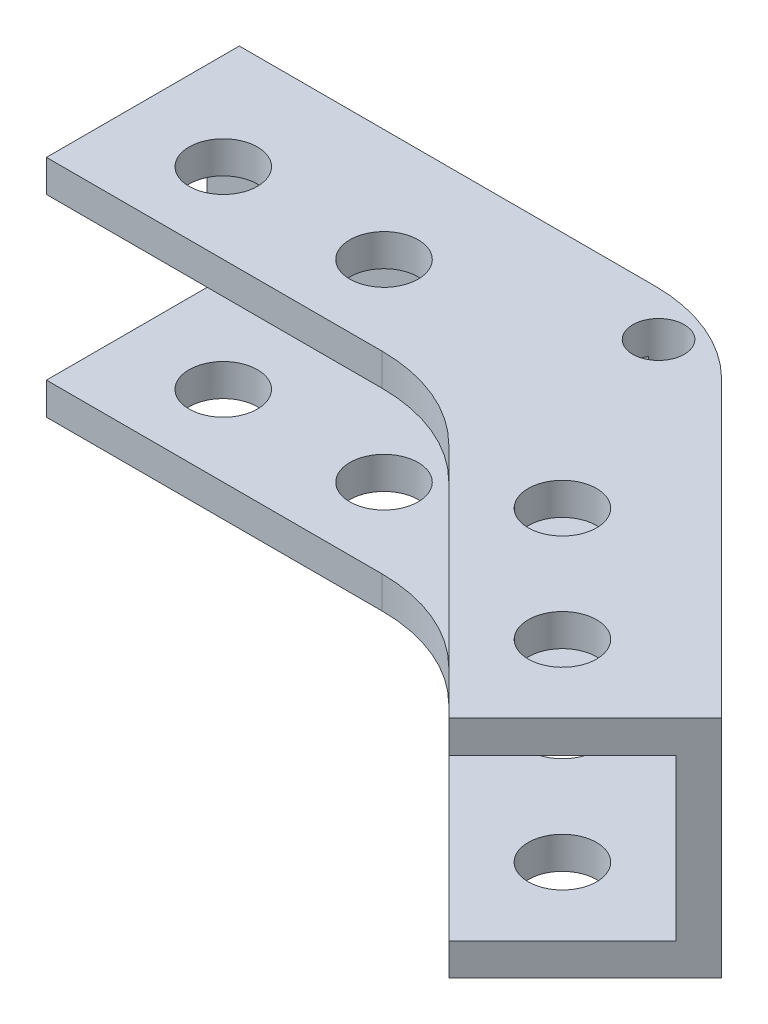
ISO-10303-21;
HEADER;
FILE_DESCRIPTION(('STEP AP214'),'2;1');
FILE_NAME('part.step','',(''),(''),'','','');
FILE_SCHEMA(('AUTOMOTIVE_DESIGN { 1 0 10303 214 1 1 1 1 }'));
ENDSEC;
DATA;
#1=APPLICATION_CONTEXT('core data for automotive mechanical design processes');
#2=APPLICATION_PROTOCOL_DEFINITION('international standard','automotive_design',2000,#1);
#3=PRODUCT_CONTEXT('',#1,'mechanical');
#4=PRODUCT('Part','Part','',(#3));
#5=PRODUCT_RELATED_PRODUCT_CATEGORY('part','',(#4));
#6=PRODUCT_DEFINITION_FORMATION('','',#4);
#7=PRODUCT_DEFINITION_CONTEXT('part definition',#1,'design');
#8=PRODUCT_DEFINITION('design','',#6,#7);
#9=PRODUCT_DEFINITION_SHAPE('','',#8);
#10=(LENGTH_UNIT() NAMED_UNIT(*) SI_UNIT(.MILLI.,.METRE.));
#11=(NAMED_UNIT(*) PLANE_ANGLE_UNIT() SI_UNIT($,.RADIAN.));
#12=(NAMED_UNIT(*) SI_UNIT($,.STERADIAN.) SOLID_ANGLE_UNIT());
#13=UNCERTAINTY_MEASURE_WITH_UNIT(LENGTH_MEASURE(1.E-05),#10,'distance_accuracy_value','');
#14=(GEOMETRIC_REPRESENTATION_CONTEXT(3) GLOBAL_UNCERTAINTY_ASSIGNED_CONTEXT((#13)) GLOBAL_UNIT_ASSIGNED_CONTEXT((#10,
#11,#12)) REPRESENTATION_CONTEXT('',''));
#15=CARTESIAN_POINT('',(0.,0.,0.));
#16=DIRECTION('',(0.,0.,1.));
#17=DIRECTION('',(1.,0.,0.));
#18=AXIS2_PLACEMENT_3D('',#15,#16,#17);
#19=CARTESIAN_POINT('',(1.66776755807594,-0.999999999999999,-7.22836140246614));
#20=DIRECTION('',(0.,1.,0.));
#21=DIRECTION('',(0.,0.,1.));
#22=AXIS2_PLACEMENT_3D('',#19,#20,#21);
#23=CYLINDRICAL_SURFACE('',#22,1.6);
#24=CARTESIAN_POINT('',(1.66776755807594,0.,-7.22836140246614));
#25=DIRECTION('',(0.,-1.,0.));
#26=DIRECTION('',(0.,0.,-1.));
#27=AXIS2_PLACEMENT_3D('',#24,#25,#26);
#28=CIRCLE('',#27,1.6);
#29=CARTESIAN_POINT('',(1.66776755807594,0.,-8.82836140246614));
#30=VERTEX_POINT('',#29);
#31=EDGE_CURVE('E298',#30,#30,#28,.T.);
#32=ORIENTED_EDGE('',*,*,#31,.T.);
#33=EDGE_LOOP('',(#32));
#34=FACE_BOUND('',#33,.T.);
#35=DIRECTION('',(0.,1.,0.));
#36=VECTOR('',#35,1.);
#37=CARTESIAN_POINT('',(3.20450234140444,-0.999999999999999,-6.78288838902055));
#38=LINE('',#37,#36);
#39=CARTESIAN_POINT('',(3.20450234140444,4.,-6.78288838902055));
#40=VERTEX_POINT('',#39);
#41=CARTESIAN_POINT('',(3.20450234140444,2.,-6.78288838902056));
#42=VERTEX_POINT('',#41);
#43=EDGE_CURVE('E284',#40,#42,#38,.F.);
#44=ORIENTED_EDGE('',*,*,#43,.F.);
#45=CARTESIAN_POINT('',(1.66776755807594,4.,-7.22836140246614));
#46=DIRECTION('',(0.,-1.,0.));
#47=DIRECTION('',(0.,0.,-1.));
#48=AXIS2_PLACEMENT_3D('',#45,#46,#47);
#49=CIRCLE('',#48,1.6);
#50=CARTESIAN_POINT('',(0.266134983256137,4.,-7.99999999999999));
#51=VERTEX_POINT('',#50);
#52=EDGE_CURVE('E483',#40,#51,#49,.F.);
#53=ORIENTED_EDGE('',*,*,#52,.T.);
#54=DIRECTION('',(0.,1.,0.));
#55=VECTOR('',#54,1.);
#56=CARTESIAN_POINT('',(0.266134983256137,-0.999999999999999,-7.99999999999999));
#57=LINE('',#56,#55);
#58=CARTESIAN_POINT('',(0.266134983256137,2.,-7.99999999999999));
#59=VERTEX_POINT('',#58);
#60=EDGE_CURVE('E290',#59,#51,#57,.T.);
#61=ORIENTED_EDGE('',*,*,#60,.F.);
#62=CARTESIAN_POINT('',(1.66776755807594,2.,-7.22836140246614));
#63=DIRECTION('',(0.,1.,0.));
#64=DIRECTION('',(0.,0.,1.));
#65=AXIS2_PLACEMENT_3D('',#62,#63,#64);
#66=CIRCLE('',#65,1.6);
#67=EDGE_CURVE('E467',#59,#42,#66,.T.);
#68=ORIENTED_EDGE('',*,*,#67,.T.);
#69=EDGE_LOOP('',(#44,#53,#61,#68));
#70=FACE_BOUND('',#69,.T.);
#71=ADVANCED_FACE('F47',(#34,#70),#23,.F.);
#72=CARTESIAN_POINT('',(1.98739073042501,14.,-7.99999999999999));
#73=DIRECTION('',(0.,0.,-1.));
#74=DIRECTION('',(-1.,0.,0.));
#75=AXIS2_PLACEMENT_3D('',#72,#73,#74);
#76=PLANE('',#75);
#77=DIRECTION('',(0.,1.,0.));
#78=VECTOR('',#77,1.);
#79=CARTESIAN_POINT('',(-4.18418214482879,14.,-7.99999999999999));
#80=LINE('',#79,#78);
#81=CARTESIAN_POINT('',(-4.18418214482879,4.,-7.99999999999999));
#82=VERTEX_POINT('',#81);
#83=CARTESIAN_POINT('',(-4.18418214482879,10.,-7.99999999999999));
#84=VERTEX_POINT('',#83);
#85=EDGE_CURVE('E276',#82,#84,#80,.T.);
#86=ORIENTED_EDGE('',*,*,#85,.T.);
#87=DIRECTION('',(1.,0.,0.));
#88=VECTOR('',#87,1.);
#89=CARTESIAN_POINT('',(1.98739073042501,10.,-7.99999999999999));
#90=LINE('',#89,#88);
#91=CARTESIAN_POINT('',(0.266134983256137,10.,-7.99999999999999));
#92=VERTEX_POINT('',#91);
#93=EDGE_CURVE('E272',#84,#92,#90,.T.);
#94=ORIENTED_EDGE('',*,*,#93,.T.);
#95=CARTESIAN_POINT('',(0.266134983256137,12.,-7.99999999999999));
#96=VERTEX_POINT('',#95);
#97=EDGE_CURVE('E289',#92,#96,#57,.T.);
#98=ORIENTED_EDGE('',*,*,#97,.T.);
#99=DIRECTION('',(-1.,0.,0.));
#100=VECTOR('',#99,1.);
#101=CARTESIAN_POINT('',(1.98739073042501,12.,-7.99999999999999));
#102=LINE('',#101,#100);
#103=CARTESIAN_POINT('',(-27.1841821448288,12.,-7.99999999999999));
#104=VERTEX_POINT('',#103);
#105=EDGE_CURVE('E392',#96,#104,#102,.T.);
#106=ORIENTED_EDGE('',*,*,#105,.T.);
#107=DIRECTION('',(0.,-1.,0.));
#108=VECTOR('',#107,1.);
#109=CARTESIAN_POINT('',(-27.1841821448288,14.,-7.99999999999999));
#110=LINE('',#109,#108);
#111=CARTESIAN_POINT('',(-27.1841821448288,2.,-7.99999999999999));
#112=VERTEX_POINT('',#111);
#113=EDGE_CURVE('E464',#104,#112,#110,.T.);
#114=ORIENTED_EDGE('',*,*,#113,.T.);
#115=DIRECTION('',(1.,0.,0.));
#116=VECTOR('',#115,1.);
#117=CARTESIAN_POINT('',(1.98739073042501,2.,-7.99999999999999));
#118=LINE('',#117,#116);
#119=EDGE_CURVE('E355',#112,#59,#118,.T.);
#120=ORIENTED_EDGE('',*,*,#119,.T.);
#121=ORIENTED_EDGE('',*,*,#60,.T.);
#122=DIRECTION('',(-1.,0.,0.));
#123=VECTOR('',#122,1.);
#124=CARTESIAN_POINT('',(1.98739073042501,4.,-7.99999999999999));
#125=LINE('',#124,#123);
#126=EDGE_CURVE('E265',#51,#82,#125,.T.);
#127=ORIENTED_EDGE('',*,*,#126,.T.);
#128=EDGE_LOOP('',(#86,#94,#98,#106,#114,#120,#121,#127));
#129=FACE_BOUND('',#128,.T.);
#130=ADVANCED_FACE('F564',(#129),#76,.F.);
#131=CARTESIAN_POINT('',(22.6148077283945,14.,12.6274169979696));
#132=DIRECTION('',(0.707106781186548,0.,-0.707106781186547));
#133=DIRECTION('',(-0.707106781186547,0.,-0.707106781186548));
#134=AXIS2_PLACEMENT_3D('',#131,#132,#133);
#135=PLANE('',#134);
#136=DIRECTION('',(0.,-1.,0.));
#137=VECTOR('',#136,1.);
#138=CARTESIAN_POINT('',(6.35135176110393,14.,-3.63603896932106));
#139=LINE('',#138,#137);
#140=CARTESIAN_POINT('',(6.35135176110393,10.,-3.63603896932106));
#141=VERTEX_POINT('',#140);
#142=CARTESIAN_POINT('',(6.35135176110393,4.,-3.63603896932106));
#143=VERTEX_POINT('',#142);
#144=EDGE_CURVE('E227',#141,#143,#139,.T.);
#145=ORIENTED_EDGE('',*,*,#144,.T.);
#146=DIRECTION('',(-0.707106781186547,0.,-0.707106781186548));
#147=VECTOR('',#146,1.);
#148=CARTESIAN_POINT('',(22.6148077283945,3.99999999999999,12.6274169979695));
#149=LINE('',#148,#147);
#150=EDGE_CURVE('E245',#143,#40,#149,.T.);
#151=ORIENTED_EDGE('',*,*,#150,.T.);
#152=ORIENTED_EDGE('',*,*,#43,.T.);
#153=DIRECTION('',(0.707106781186547,0.,0.707106781186548));
#154=VECTOR('',#153,1.);
#155=CARTESIAN_POINT('',(22.6148077283945,2.,12.6274169979696));
#156=LINE('',#155,#154);
#157=CARTESIAN_POINT('',(22.6148077283945,2.,12.6274169979696));
#158=VERTEX_POINT('',#157);
#159=EDGE_CURVE('E359',#42,#158,#156,.T.);
#160=ORIENTED_EDGE('',*,*,#159,.T.);
#161=DIRECTION('',(0.,-1.,0.));
#162=VECTOR('',#161,1.);
#163=CARTESIAN_POINT('',(22.6148077283945,14.,12.6274169979696));
#164=LINE('',#163,#162);
#165=CARTESIAN_POINT('',(22.6148077283945,12.,12.6274169979696));
#166=VERTEX_POINT('',#165);
#167=EDGE_CURVE('E460',#166,#158,#164,.T.);
#168=ORIENTED_EDGE('',*,*,#167,.F.);
#169=DIRECTION('',(-0.707106781186547,0.,-0.707106781186548));
#170=VECTOR('',#169,1.);
#171=CARTESIAN_POINT('',(22.6148077283945,12.,12.6274169979696));
#172=LINE('',#171,#170);
#173=CARTESIAN_POINT('',(3.20450234140444,12.,-6.78288838902055));
#174=VERTEX_POINT('',#173);
#175=EDGE_CURVE('E410',#166,#174,#172,.T.);
#176=ORIENTED_EDGE('',*,*,#175,.T.);
#177=CARTESIAN_POINT('',(3.20450234140444,10.,-6.78288838902055));
#178=VERTEX_POINT('',#177);
#179=EDGE_CURVE('E285',#174,#178,#38,.F.);
#180=ORIENTED_EDGE('',*,*,#179,.T.);
#181=DIRECTION('',(0.707106781186547,0.,0.707106781186548));
#182=VECTOR('',#181,1.);
#183=CARTESIAN_POINT('',(22.6148077283945,10.,12.6274169979696));
#184=LINE('',#183,#182);
#185=EDGE_CURVE('E241',#178,#141,#184,.T.);
#186=ORIENTED_EDGE('',*,*,#185,.T.);
#187=EDGE_LOOP('',(#145,#151,#152,#160,#168,#176,#180,#186));
#188=FACE_BOUND('',#187,.T.);
#189=ADVANCED_FACE('F537',(#188),#135,.F.);
#190=CARTESIAN_POINT('',(-27.1841821448288,14.,-7.99999999999999));
#191=DIRECTION('',(1.,0.,0.));
#192=DIRECTION('',(0.,0.,-1.));
#193=AXIS2_PLACEMENT_3D('',#190,#191,#192);
#194=PLANE('',#193);
#195=DIRECTION('',(0.,0.,1.));
#196=VECTOR('',#195,1.);
#197=CARTESIAN_POINT('',(-27.1841821448288,0.,-7.99999999999999));
#198=LINE('',#197,#196);
#199=CARTESIAN_POINT('',(-27.1841821448288,0.,-9.99999999999999));
#200=VERTEX_POINT('',#199);
#201=CARTESIAN_POINT('',(-27.1841821448288,0.,2.00000000000001));
#202=VERTEX_POINT('',#201);
#203=EDGE_CURVE('E423',#200,#202,#198,.T.);
#204=ORIENTED_EDGE('',*,*,#203,.T.);
#205=DIRECTION('',(0.,-1.,0.));
#206=VECTOR('',#205,1.);
#207=CARTESIAN_POINT('',(-27.1841821448288,2.,2.00000000000001));
#208=LINE('',#207,#206);
#209=CARTESIAN_POINT('',(-27.1841821448288,2.,2.00000000000001));
#210=VERTEX_POINT('',#209);
#211=EDGE_CURVE('E384',#210,#202,#208,.T.);
#212=ORIENTED_EDGE('',*,*,#211,.F.);
#213=DIRECTION('',(0.,0.,-1.));
#214=VECTOR('',#213,1.);
#215=CARTESIAN_POINT('',(-27.1841821448288,2.,-7.99999999999999));
#216=LINE('',#215,#214);
#217=EDGE_CURVE('E374',#210,#112,#216,.T.);
#218=ORIENTED_EDGE('',*,*,#217,.T.);
#219=ORIENTED_EDGE('',*,*,#113,.F.);
#220=DIRECTION('',(0.,0.,1.));
#221=VECTOR('',#220,1.);
#222=CARTESIAN_POINT('',(-27.1841821448288,12.,-7.99999999999999));
#223=LINE('',#222,#221);
#224=CARTESIAN_POINT('',(-27.1841821448288,12.,2.00000000000001));
#225=VERTEX_POINT('',#224);
#226=EDGE_CURVE('E395',#104,#225,#223,.T.);
#227=ORIENTED_EDGE('',*,*,#226,.T.);
#228=DIRECTION('',(0.,1.,0.));
#229=VECTOR('',#228,1.);
#230=CARTESIAN_POINT('',(-27.1841821448288,12.,2.00000000000001));
#231=LINE('',#230,#229);
#232=CARTESIAN_POINT('',(-27.1841821448288,14.,2.00000000000001));
#233=VERTEX_POINT('',#232);
#234=EDGE_CURVE('E414',#225,#233,#231,.T.);
#235=ORIENTED_EDGE('',*,*,#234,.T.);
#236=DIRECTION('',(0.,0.,1.));
#237=VECTOR('',#236,1.);
#238=CARTESIAN_POINT('',(-27.1841821448288,14.,-7.99999999999999));
#239=LINE('',#238,#237);
#240=CARTESIAN_POINT('',(-27.1841821448288,14.,-9.99999999999999));
#241=VERTEX_POINT('',#240);
#242=EDGE_CURVE('E427',#241,#233,#239,.T.);
#243=ORIENTED_EDGE('',*,*,#242,.F.);
#244=DIRECTION('',(0.,-1.,0.));
#245=VECTOR('',#244,1.);
#246=CARTESIAN_POINT('',(-27.1841821448288,14.,-9.99999999999999));
#247=LINE('',#246,#245);
#248=EDGE_CURVE('E441',#241,#200,#247,.T.);
#249=ORIENTED_EDGE('',*,*,#248,.T.);
#250=EDGE_LOOP('',(#204,#212,#218,#219,#227,#235,#243,#249));
#251=FACE_BOUND('',#250,.T.);
#252=ADVANCED_FACE('F604',(#251),#194,.F.);
#253=CARTESIAN_POINT('',(24.0290212907676,14.,11.2132034355965));
#254=DIRECTION('',(-0.707106781186546,0.,-0.707106781186549));
#255=DIRECTION('',(-0.707106781186549,0.,0.707106781186546));
#256=AXIS2_PLACEMENT_3D('',#253,#254,#255);
#257=PLANE('',#256);
#258=DIRECTION('',(0.707106781186549,0.,-0.707106781186546));
#259=VECTOR('',#258,1.);
#260=CARTESIAN_POINT('',(24.0290212907676,0.,11.2132034355965));
#261=LINE('',#260,#259);
#262=CARTESIAN_POINT('',(15.543739916529,0.,19.698484809835));
#263=VERTEX_POINT('',#262);
#264=CARTESIAN_POINT('',(24.0290212907676,0.,11.2132034355965));
#265=VERTEX_POINT('',#264);
#266=EDGE_CURVE('E445',#263,#265,#261,.T.);
#267=ORIENTED_EDGE('',*,*,#266,.T.);
#268=DIRECTION('',(0.,-1.,0.));
#269=VECTOR('',#268,1.);
#270=CARTESIAN_POINT('',(24.0290212907676,14.,11.2132034355965));
#271=LINE('',#270,#269);
#272=CARTESIAN_POINT('',(24.0290212907676,14.,11.2132034355965));
#273=VERTEX_POINT('',#272);
#274=EDGE_CURVE('E456',#273,#265,#271,.T.);
#275=ORIENTED_EDGE('',*,*,#274,.F.);
#276=DIRECTION('',(0.707106781186549,0.,-0.707106781186546));
#277=VECTOR('',#276,1.);
#278=CARTESIAN_POINT('',(24.0290212907676,14.,11.2132034355965));
#279=LINE('',#278,#277);
#280=CARTESIAN_POINT('',(15.543739916529,14.,19.698484809835));
#281=VERTEX_POINT('',#280);
#282=EDGE_CURVE('E430',#281,#273,#279,.T.);
#283=ORIENTED_EDGE('',*,*,#282,.F.);
#284=DIRECTION('',(0.,1.,0.));
#285=VECTOR('',#284,1.);
#286=CARTESIAN_POINT('',(15.543739916529,12.,19.698484809835));
#287=LINE('',#286,#285);
#288=CARTESIAN_POINT('',(15.543739916529,12.,19.698484809835));
#289=VERTEX_POINT('',#288);
#290=EDGE_CURVE('E419',#289,#281,#287,.T.);
#291=ORIENTED_EDGE('',*,*,#290,.F.);
#292=DIRECTION('',(0.707106781186548,0.,-0.707106781186547));
#293=VECTOR('',#292,1.);
#294=CARTESIAN_POINT('',(15.543739916529,12.,19.698484809835));
#295=LINE('',#294,#293);
#296=EDGE_CURVE('E407',#289,#166,#295,.T.);
#297=ORIENTED_EDGE('',*,*,#296,.T.);
#298=ORIENTED_EDGE('',*,*,#167,.T.);
#299=DIRECTION('',(-0.707106781186548,0.,0.707106781186547));
#300=VECTOR('',#299,1.);
#301=CARTESIAN_POINT('',(15.543739916529,2.,19.698484809835));
#302=LINE('',#301,#300);
#303=CARTESIAN_POINT('',(15.543739916529,2.,19.698484809835));
#304=VERTEX_POINT('',#303);
#305=EDGE_CURVE('E363',#158,#304,#302,.T.);
#306=ORIENTED_EDGE('',*,*,#305,.T.);
#307=DIRECTION('',(0.,-1.,0.));
#308=VECTOR('',#307,1.);
#309=CARTESIAN_POINT('',(15.543739916529,2.,19.698484809835));
#310=LINE('',#309,#308);
#311=EDGE_CURVE('E378',#304,#263,#310,.T.);
#312=ORIENTED_EDGE('',*,*,#311,.T.);
#313=EDGE_LOOP('',(#267,#275,#283,#291,#297,#298,#306,#312));
#314=FACE_BOUND('',#313,.T.);
#315=ADVANCED_FACE('F549',(#314),#257,.F.);
#316=CARTESIAN_POINT('',(2.81581785517121,14.,-9.99999999999999));
#317=DIRECTION('',(-0.707106781186549,0.,0.707106781186547));
#318=DIRECTION('',(0.707106781186546,0.,0.707106781186549));
#319=AXIS2_PLACEMENT_3D('',#316,#317,#318);
#320=PLANE('',#319);
#321=DIRECTION('',(-0.707106781186546,0.,-0.707106781186549));
#322=VECTOR('',#321,1.);
#323=CARTESIAN_POINT('',(2.81581785517121,0.,-9.99999999999999));
#324=LINE('',#323,#322);
#325=CARTESIAN_POINT('',(5.74475004330574,0.,-7.07106781186546));
#326=VERTEX_POINT('',#325);
#327=EDGE_CURVE('E448',#265,#326,#324,.T.);
#328=ORIENTED_EDGE('',*,*,#327,.T.);
#329=DIRECTION('',(0.,-1.,0.));
#330=VECTOR('',#329,1.);
#331=CARTESIAN_POINT('',(5.74475004330574,14.,-7.07106781186546));
#332=LINE('',#331,#330);
#333=CARTESIAN_POINT('',(5.74475004330574,4.,-7.07106781186546));
#334=VERTEX_POINT('',#333);
#335=EDGE_CURVE('E503',#326,#334,#332,.F.);
#336=ORIENTED_EDGE('',*,*,#335,.T.);
#337=DIRECTION('',(-0.707106781186547,0.,-0.707106781186549));
#338=VECTOR('',#337,1.);
#339=CARTESIAN_POINT('',(2.81581785517121,4.,-9.99999999999999));
#340=LINE('',#339,#338);
#341=CARTESIAN_POINT('',(7.76556532347703,4.,-5.05025253169415));
#342=VERTEX_POINT('',#341);
#343=EDGE_CURVE('E230',#342,#334,#340,.T.);
#344=ORIENTED_EDGE('',*,*,#343,.F.);
#345=DIRECTION('',(0.,-1.,0.));
#346=VECTOR('',#345,1.);
#347=CARTESIAN_POINT('',(7.76556532347703,10.,-5.05025253169415));
#348=LINE('',#347,#346);
#349=CARTESIAN_POINT('',(7.76556532347703,10.,-5.05025253169415));
#350=VERTEX_POINT('',#349);
#351=EDGE_CURVE('E219',#350,#342,#348,.T.);
#352=ORIENTED_EDGE('',*,*,#351,.F.);
#353=DIRECTION('',(0.707106781186547,0.,0.707106781186549));
#354=VECTOR('',#353,1.);
#355=CARTESIAN_POINT('',(2.81581785517121,10.,-9.99999999999999));
#356=LINE('',#355,#354);
#357=CARTESIAN_POINT('',(5.74475004330574,10.,-7.07106781186546));
#358=VERTEX_POINT('',#357);
#359=EDGE_CURVE('E207',#358,#350,#356,.T.);
#360=ORIENTED_EDGE('',*,*,#359,.F.);
#361=DIRECTION('',(0.,-1.,0.));
#362=VECTOR('',#361,1.);
#363=CARTESIAN_POINT('',(5.74475004330574,14.,-7.07106781186546));
#364=LINE('',#363,#362);
#365=CARTESIAN_POINT('',(5.74475004330574,14.,-7.07106781186546));
#366=VERTEX_POINT('',#365);
#367=EDGE_CURVE('E500',#358,#366,#364,.F.);
#368=ORIENTED_EDGE('',*,*,#367,.T.);
#369=DIRECTION('',(-0.707106781186546,0.,-0.707106781186549));
#370=VECTOR('',#369,1.);
#371=CARTESIAN_POINT('',(2.81581785517121,14.,-9.99999999999999));
#372=LINE('',#371,#370);
#373=EDGE_CURVE('E434',#273,#366,#372,.T.);
#374=ORIENTED_EDGE('',*,*,#373,.F.);
#375=ORIENTED_EDGE('',*,*,#274,.T.);
#376=EDGE_LOOP('',(#328,#336,#344,#352,#360,#368,#374,#375));
#377=FACE_BOUND('',#376,.T.);
#378=ADVANCED_FACE('F233',(#377),#320,.F.);
#379=CARTESIAN_POINT('',(-27.1841821448288,14.,-9.99999999999999));
#380=DIRECTION('',(0.,0.,1.));
#381=DIRECTION('',(1.,0.,0.));
#382=AXIS2_PLACEMENT_3D('',#379,#380,#381);
#383=PLANE('',#382);
#384=DIRECTION('',(-1.,0.,0.));
#385=VECTOR('',#384,1.);
#386=CARTESIAN_POINT('',(2.81581785517121,4.,-9.99999999999999));
#387=LINE('',#386,#385);
#388=CARTESIAN_POINT('',(-1.32631776855975,4.,-9.99999999999999));
#389=VERTEX_POINT('',#388);
#390=CARTESIAN_POINT('',(-4.18418214482879,4.,-9.99999999999999));
#391=VERTEX_POINT('',#390);
#392=EDGE_CURVE('E251',#389,#391,#387,.T.);
#393=ORIENTED_EDGE('',*,*,#392,.F.);
#394=DIRECTION('',(0.,-1.,0.));
#395=VECTOR('',#394,1.);
#396=CARTESIAN_POINT('',(-1.32631776855975,14.,-9.99999999999999));
#397=LINE('',#396,#395);
#398=CARTESIAN_POINT('',(-1.32631776855975,0.,-9.99999999999999));
#399=VERTEX_POINT('',#398);
#400=EDGE_CURVE('E493',#389,#399,#397,.T.);
#401=ORIENTED_EDGE('',*,*,#400,.T.);
#402=DIRECTION('',(-1.,0.,0.));
#403=VECTOR('',#402,1.);
#404=CARTESIAN_POINT('',(-27.1841821448288,0.,-9.99999999999999));
#405=LINE('',#404,#403);
#406=EDGE_CURVE('E431',#399,#200,#405,.T.);
#407=ORIENTED_EDGE('',*,*,#406,.T.);
#408=ORIENTED_EDGE('',*,*,#248,.F.);
#409=DIRECTION('',(-1.,0.,0.));
#410=VECTOR('',#409,1.);
#411=CARTESIAN_POINT('',(-27.1841821448288,14.,-9.99999999999999));
#412=LINE('',#411,#410);
#413=CARTESIAN_POINT('',(-1.32631776855975,14.,-9.99999999999999));
#414=VERTEX_POINT('',#413);
#415=EDGE_CURVE('E438',#414,#241,#412,.T.);
#416=ORIENTED_EDGE('',*,*,#415,.F.);
#417=DIRECTION('',(0.,-1.,0.));
#418=VECTOR('',#417,1.);
#419=CARTESIAN_POINT('',(-1.32631776855975,14.,-9.99999999999999));
#420=LINE('',#419,#418);
#421=CARTESIAN_POINT('',(-1.32631776855975,10.,-9.99999999999999));
#422=VERTEX_POINT('',#421);
#423=EDGE_CURVE('E489',#414,#422,#420,.T.);
#424=ORIENTED_EDGE('',*,*,#423,.T.);
#425=DIRECTION('',(1.,0.,0.));
#426=VECTOR('',#425,1.);
#427=CARTESIAN_POINT('',(2.81581785517121,10.,-9.99999999999999));
#428=LINE('',#427,#426);
#429=CARTESIAN_POINT('',(-4.18418214482879,10.,-9.99999999999999));
#430=VERTEX_POINT('',#429);
#431=EDGE_CURVE('E258',#430,#422,#428,.T.);
#432=ORIENTED_EDGE('',*,*,#431,.F.);
#433=DIRECTION('',(0.,1.,0.));
#434=VECTOR('',#433,1.);
#435=CARTESIAN_POINT('',(-4.18418214482879,10.,-9.99999999999999));
#436=LINE('',#435,#434);
#437=EDGE_CURVE('E254',#391,#430,#436,.T.);
#438=ORIENTED_EDGE('',*,*,#437,.F.);
#439=EDGE_LOOP('',(#393,#401,#407,#408,#416,#424,#432,#438));
#440=FACE_BOUND('',#439,.T.);
#441=ADVANCED_FACE('F576',(#440),#383,.F.);
#442=CARTESIAN_POINT('',(0.,14.,0.));
#443=DIRECTION('',(0.,-1.,0.));
#444=DIRECTION('',(0.,0.,-1.));
#445=AXIS2_PLACEMENT_3D('',#442,#443,#444);
#446=PLANE('',#445);
#447=CARTESIAN_POINT('',(1.66776755807594,14.,-7.22836140246614));
#448=DIRECTION('',(0.,1.,0.));
#449=DIRECTION('',(0.,0.,1.));
#450=AXIS2_PLACEMENT_3D('',#447,#448,#449);
#451=CIRCLE('',#450,1.6);
#452=CARTESIAN_POINT('',(1.66776755807594,14.,-5.62836140246614));
#453=VERTEX_POINT('',#452);
#454=EDGE_CURVE('E280',#453,#453,#451,.T.);
#455=ORIENTED_EDGE('',*,*,#454,.F.);
#456=EDGE_LOOP('',(#455));
#457=FACE_BOUND('',#456,.T.);
#458=CARTESIAN_POINT('',(-21.1841821448288,14.,-2.99999999999999));
#459=DIRECTION('',(0.,1.,0.));
#460=DIRECTION('',(0.,0.,1.));
#461=AXIS2_PLACEMENT_3D('',#458,#459,#460);
#462=CIRCLE('',#461,2.125);
#463=CARTESIAN_POINT('',(-21.1841821448288,14.,-0.874999999999992));
#464=VERTEX_POINT('',#463);
#465=EDGE_CURVE('E303',#464,#464,#462,.T.);
#466=ORIENTED_EDGE('',*,*,#465,.F.);
#467=EDGE_LOOP('',(#466));
#468=FACE_BOUND('',#467,.T.);
#469=CARTESIAN_POINT('',(-11.1841821448288,14.,-2.99999999999999));
#470=DIRECTION('',(0.,1.,0.));
#471=DIRECTION('',(0.,0.,1.));
#472=AXIS2_PLACEMENT_3D('',#469,#470,#471);
#473=CIRCLE('',#472,2.125);
#474=CARTESIAN_POINT('',(-11.1841821448288,14.,-0.874999999999996));
#475=VERTEX_POINT('',#474);
#476=EDGE_CURVE('E308',#475,#475,#473,.T.);
#477=ORIENTED_EDGE('',*,*,#476,.F.);
#478=EDGE_LOOP('',(#477));
#479=FACE_BOUND('',#478,.T.);
#480=CARTESIAN_POINT('',(7.765565323477,14.,4.84924240491752));
#481=DIRECTION('',(0.,1.,0.));
#482=DIRECTION('',(0.,0.,1.));
#483=AXIS2_PLACEMENT_3D('',#480,#481,#482);
#484=CIRCLE('',#483,2.125);
#485=CARTESIAN_POINT('',(7.765565323477,14.,6.97424240491752));
#486=VERTEX_POINT('',#485);
#487=EDGE_CURVE('E312',#486,#486,#484,.T.);
#488=ORIENTED_EDGE('',*,*,#487,.F.);
#489=EDGE_LOOP('',(#488));
#490=FACE_BOUND('',#489,.T.);
#491=CARTESIAN_POINT('',(14.8366331353425,14.,11.920310216783));
#492=DIRECTION('',(0.,1.,0.));
#493=DIRECTION('',(0.,0.,1.));
#494=AXIS2_PLACEMENT_3D('',#491,#492,#493);
#495=CIRCLE('',#494,2.125);
#496=CARTESIAN_POINT('',(14.8366331353425,14.,14.045310216783));
#497=VERTEX_POINT('',#496);
#498=EDGE_CURVE('E302',#497,#497,#495,.T.);
#499=ORIENTED_EDGE('',*,*,#498,.F.);
#500=EDGE_LOOP('',(#499));
#501=FACE_BOUND('',#500,.T.);
#502=ORIENTED_EDGE('',*,*,#373,.T.);
#503=CARTESIAN_POINT('',(-1.32631776855975,14.,0.));
#504=DIRECTION('',(0.,-1.,0.));
#505=DIRECTION('',(0.,0.,-1.));
#506=AXIS2_PLACEMENT_3D('',#503,#504,#505);
#507=CIRCLE('',#506,10.);
#508=EDGE_CURVE('E511',#366,#414,#507,.F.);
#509=ORIENTED_EDGE('',*,*,#508,.T.);
#510=ORIENTED_EDGE('',*,*,#415,.T.);
#511=ORIENTED_EDGE('',*,*,#242,.T.);
#512=DIRECTION('',(1.,0.,0.));
#513=VECTOR('',#512,1.);
#514=CARTESIAN_POINT('',(-27.1841821448288,14.,2.00000000000001));
#515=LINE('',#514,#513);
#516=CARTESIAN_POINT('',(-6.2968805170369,14.,2.00000000000001));
#517=VERTEX_POINT('',#516);
#518=EDGE_CURVE('E388',#233,#517,#515,.T.);
#519=ORIENTED_EDGE('',*,*,#518,.T.);
#520=CARTESIAN_POINT('',(-6.2968805170369,14.,12.));
#521=DIRECTION('',(0.,-1.,0.));
#522=DIRECTION('',(0.,0.,-1.));
#523=AXIS2_PLACEMENT_3D('',#520,#521,#522);
#524=CIRCLE('',#523,10.);
#525=CARTESIAN_POINT('',(0.77418729482858,14.,4.92893218813454));
#526=VERTEX_POINT('',#525);
#527=EDGE_CURVE('E56',#517,#526,#524,.T.);
#528=ORIENTED_EDGE('',*,*,#527,.T.);
#529=DIRECTION('',(0.707106781186547,0.,0.707106781186548));
#530=VECTOR('',#529,1.);
#531=CARTESIAN_POINT('',(-2.15474489330595,14.,2.00000000000001));
#532=LINE('',#531,#530);
#533=EDGE_CURVE('E396',#526,#281,#532,.T.);
#534=ORIENTED_EDGE('',*,*,#533,.T.);
#535=ORIENTED_EDGE('',*,*,#282,.T.);
#536=EDGE_LOOP('',(#502,#509,#510,#511,#519,#528,#534,#535));
#537=FACE_BOUND('',#536,.T.);
#538=ADVANCED_FACE('F612',(#457,#468,#479,#490,#501,#537),#446,.F.);
#539=CARTESIAN_POINT('',(0.,0.,0.));
#540=DIRECTION('',(0.,-1.,0.));
#541=DIRECTION('',(0.,0.,-1.));
#542=AXIS2_PLACEMENT_3D('',#539,#540,#541);
#543=PLANE('',#542);
#544=ORIENTED_EDGE('',*,*,#31,.F.);
#545=EDGE_LOOP('',(#544));
#546=FACE_BOUND('',#545,.T.);
#547=CARTESIAN_POINT('',(-21.1841821448288,0.,-2.99999999999999));
#548=DIRECTION('',(0.,-1.,0.));
#549=DIRECTION('',(0.,0.,-1.));
#550=AXIS2_PLACEMENT_3D('',#547,#548,#549);
#551=CIRCLE('',#550,2.125);
#552=CARTESIAN_POINT('',(-21.1841821448288,0.,-5.125));
#553=VERTEX_POINT('',#552);
#554=EDGE_CURVE('E350',#553,#553,#551,.T.);
#555=ORIENTED_EDGE('',*,*,#554,.F.);
#556=EDGE_LOOP('',(#555));
#557=FACE_BOUND('',#556,.T.);
#558=CARTESIAN_POINT('',(-11.1841821448288,0.,-2.99999999999999));
#559=DIRECTION('',(0.,-1.,0.));
#560=DIRECTION('',(0.,0.,-1.));
#561=AXIS2_PLACEMENT_3D('',#558,#559,#560);
#562=CIRCLE('',#561,2.125);
#563=CARTESIAN_POINT('',(-11.1841821448288,0.,-5.12499999999999));
#564=VERTEX_POINT('',#563);
#565=EDGE_CURVE('E341',#564,#564,#562,.T.);
#566=ORIENTED_EDGE('',*,*,#565,.F.);
#567=EDGE_LOOP('',(#566));
#568=FACE_BOUND('',#567,.T.);
#569=CARTESIAN_POINT('',(7.765565323477,0.,4.84924240491752));
#570=DIRECTION('',(0.,-1.,0.));
#571=DIRECTION('',(0.,0.,-1.));
#572=AXIS2_PLACEMENT_3D('',#569,#570,#571);
#573=CIRCLE('',#572,2.125);
#574=CARTESIAN_POINT('',(7.765565323477,0.,2.72424240491752));
#575=VERTEX_POINT('',#574);
#576=EDGE_CURVE('E332',#575,#575,#573,.T.);
#577=ORIENTED_EDGE('',*,*,#576,.F.);
#578=EDGE_LOOP('',(#577));
#579=FACE_BOUND('',#578,.T.);
#580=CARTESIAN_POINT('',(14.8366331353425,0.,11.920310216783));
#581=DIRECTION('',(0.,-1.,0.));
#582=DIRECTION('',(0.,0.,-1.));
#583=AXIS2_PLACEMENT_3D('',#580,#581,#582);
#584=CIRCLE('',#583,2.125);
#585=CARTESIAN_POINT('',(14.8366331353425,0.,9.795310216783));
#586=VERTEX_POINT('',#585);
#587=EDGE_CURVE('E323',#586,#586,#584,.T.);
#588=ORIENTED_EDGE('',*,*,#587,.F.);
#589=EDGE_LOOP('',(#588));
#590=FACE_BOUND('',#589,.T.);
#591=ORIENTED_EDGE('',*,*,#406,.F.);
#592=CARTESIAN_POINT('',(-1.32631776855975,0.,0.));
#593=DIRECTION('',(0.,-1.,0.));
#594=DIRECTION('',(0.,0.,-1.));
#595=AXIS2_PLACEMENT_3D('',#592,#593,#594);
#596=CIRCLE('',#595,10.);
#597=EDGE_CURVE('E497',#399,#326,#596,.T.);
#598=ORIENTED_EDGE('',*,*,#597,.T.);
#599=ORIENTED_EDGE('',*,*,#327,.F.);
#600=ORIENTED_EDGE('',*,*,#266,.F.);
#601=DIRECTION('',(-0.707106781186547,0.,-0.707106781186548));
#602=VECTOR('',#601,1.);
#603=CARTESIAN_POINT('',(-2.15474489330595,0.,2.00000000000001));
#604=LINE('',#603,#602);
#605=CARTESIAN_POINT('',(0.77418729482858,0.,4.92893218813454));
#606=VERTEX_POINT('',#605);
#607=EDGE_CURVE('E354',#263,#606,#604,.T.);
#608=ORIENTED_EDGE('',*,*,#607,.T.);
#609=CARTESIAN_POINT('',(-6.2968805170369,0.,12.));
#610=DIRECTION('',(0.,-1.,0.));
#611=DIRECTION('',(0.,0.,-1.));
#612=AXIS2_PLACEMENT_3D('',#609,#610,#611);
#613=CIRCLE('',#612,10.);
#614=CARTESIAN_POINT('',(-6.2968805170369,0.,2.00000000000001));
#615=VERTEX_POINT('',#614);
#616=EDGE_CURVE('E527',#606,#615,#613,.F.);
#617=ORIENTED_EDGE('',*,*,#616,.T.);
#618=DIRECTION('',(-1.,0.,0.));
#619=VECTOR('',#618,1.);
#620=CARTESIAN_POINT('',(-27.1841821448288,0.,2.00000000000001));
#621=LINE('',#620,#619);
#622=EDGE_CURVE('E360',#615,#202,#621,.T.);
#623=ORIENTED_EDGE('',*,*,#622,.T.);
#624=ORIENTED_EDGE('',*,*,#203,.F.);
#625=EDGE_LOOP('',(#591,#598,#599,#600,#608,#617,#623,#624));
#626=FACE_BOUND('',#625,.T.);
#627=ADVANCED_FACE('F584',(#546,#557,#568,#579,#590,#626),#543,.T.);
#628=CARTESIAN_POINT('',(-2.15474489330595,12.,2.00000000000001));
#629=DIRECTION('',(-0.707106781186548,0.,0.707106781186547));
#630=DIRECTION('',(0.707106781186547,0.,0.707106781186548));
#631=AXIS2_PLACEMENT_3D('',#628,#629,#630);
#632=PLANE('',#631);
#633=ORIENTED_EDGE('',*,*,#533,.F.);
#634=DIRECTION('',(0.,1.,0.));
#635=VECTOR('',#634,1.);
#636=CARTESIAN_POINT('',(0.77418729482858,12.,4.92893218813454));
#637=LINE('',#636,#635);
#638=CARTESIAN_POINT('',(0.77418729482858,12.,4.92893218813454));
#639=VERTEX_POINT('',#638);
#640=EDGE_CURVE('E63',#526,#639,#637,.F.);
#641=ORIENTED_EDGE('',*,*,#640,.T.);
#642=DIRECTION('',(0.707106781186547,0.,0.707106781186548));
#643=VECTOR('',#642,1.);
#644=CARTESIAN_POINT('',(-2.15474489330595,12.,2.00000000000001));
#645=LINE('',#644,#643);
#646=EDGE_CURVE('E404',#639,#289,#645,.T.);
#647=ORIENTED_EDGE('',*,*,#646,.T.);
#648=ORIENTED_EDGE('',*,*,#290,.T.);
#649=EDGE_LOOP('',(#633,#641,#647,#648));
#650=FACE_BOUND('',#649,.T.);
#651=ADVANCED_FACE('F613',(#650),#632,.T.);
#652=CARTESIAN_POINT('',(-27.1841821448288,12.,2.00000000000001));
#653=DIRECTION('',(0.,0.,1.));
#654=DIRECTION('',(1.,0.,0.));
#655=AXIS2_PLACEMENT_3D('',#652,#653,#654);
#656=PLANE('',#655);
#657=DIRECTION('',(1.,0.,0.));
#658=VECTOR('',#657,1.);
#659=CARTESIAN_POINT('',(-27.1841821448288,12.,2.00000000000001));
#660=LINE('',#659,#658);
#661=CARTESIAN_POINT('',(-6.2968805170369,12.,2.00000000000001));
#662=VERTEX_POINT('',#661);
#663=EDGE_CURVE('E400',#225,#662,#660,.T.);
#664=ORIENTED_EDGE('',*,*,#663,.T.);
#665=DIRECTION('',(0.,1.,0.));
#666=VECTOR('',#665,1.);
#667=CARTESIAN_POINT('',(-6.2968805170369,14.,2.00000000000001));
#668=LINE('',#667,#666);
#669=EDGE_CURVE('E521',#662,#517,#668,.T.);
#670=ORIENTED_EDGE('',*,*,#669,.T.);
#671=ORIENTED_EDGE('',*,*,#518,.F.);
#672=ORIENTED_EDGE('',*,*,#234,.F.);
#673=EDGE_LOOP('',(#664,#670,#671,#672));
#674=FACE_BOUND('',#673,.T.);
#675=ADVANCED_FACE('F619',(#674),#656,.T.);
#676=CARTESIAN_POINT('',(0.,12.,0.));
#677=DIRECTION('',(0.,1.,0.));
#678=DIRECTION('',(0.,0.,1.));
#679=AXIS2_PLACEMENT_3D('',#676,#677,#678);
#680=PLANE('',#679);
#681=CARTESIAN_POINT('',(-21.1841821448288,12.,-2.99999999999999));
#682=DIRECTION('',(0.,1.,0.));
#683=DIRECTION('',(0.,0.,1.));
#684=AXIS2_PLACEMENT_3D('',#681,#682,#683);
#685=CIRCLE('',#684,2.125);
#686=CARTESIAN_POINT('',(-21.1841821448288,12.,-0.874999999999992));
#687=VERTEX_POINT('',#686);
#688=EDGE_CURVE('E346',#687,#687,#685,.T.);
#689=ORIENTED_EDGE('',*,*,#688,.T.);
#690=EDGE_LOOP('',(#689));
#691=FACE_BOUND('',#690,.T.);
#692=CARTESIAN_POINT('',(-11.1841821448288,12.,-2.99999999999999));
#693=DIRECTION('',(0.,1.,0.));
#694=DIRECTION('',(0.,0.,1.));
#695=AXIS2_PLACEMENT_3D('',#692,#693,#694);
#696=CIRCLE('',#695,2.125);
#697=CARTESIAN_POINT('',(-11.1841821448288,12.,-0.874999999999996));
#698=VERTEX_POINT('',#697);
#699=EDGE_CURVE('E337',#698,#698,#696,.T.);
#700=ORIENTED_EDGE('',*,*,#699,.T.);
#701=EDGE_LOOP('',(#700));
#702=FACE_BOUND('',#701,.T.);
#703=CARTESIAN_POINT('',(7.765565323477,12.,4.84924240491752));
#704=DIRECTION('',(0.,1.,0.));
#705=DIRECTION('',(0.,0.,1.));
#706=AXIS2_PLACEMENT_3D('',#703,#704,#705);
#707=CIRCLE('',#706,2.125);
#708=CARTESIAN_POINT('',(7.765565323477,12.,6.97424240491752));
#709=VERTEX_POINT('',#708);
#710=EDGE_CURVE('E328',#709,#709,#707,.T.);
#711=ORIENTED_EDGE('',*,*,#710,.T.);
#712=EDGE_LOOP('',(#711));
#713=FACE_BOUND('',#712,.T.);
#714=CARTESIAN_POINT('',(14.8366331353425,12.,11.920310216783));
#715=DIRECTION('',(0.,1.,0.));
#716=DIRECTION('',(0.,0.,1.));
#717=AXIS2_PLACEMENT_3D('',#714,#715,#716);
#718=CIRCLE('',#717,2.125);
#719=CARTESIAN_POINT('',(14.8366331353425,12.,14.045310216783));
#720=VERTEX_POINT('',#719);
#721=EDGE_CURVE('E319',#720,#720,#718,.T.);
#722=ORIENTED_EDGE('',*,*,#721,.T.);
#723=EDGE_LOOP('',(#722));
#724=FACE_BOUND('',#723,.T.);
#725=ORIENTED_EDGE('',*,*,#105,.F.);
#726=CARTESIAN_POINT('',(1.66776755807594,12.,-7.22836140246614));
#727=DIRECTION('',(0.,1.,0.));
#728=DIRECTION('',(0.,0.,1.));
#729=AXIS2_PLACEMENT_3D('',#726,#727,#728);
#730=CIRCLE('',#729,1.6);
#731=EDGE_CURVE('E294',#96,#174,#730,.T.);
#732=ORIENTED_EDGE('',*,*,#731,.T.);
#733=ORIENTED_EDGE('',*,*,#175,.F.);
#734=ORIENTED_EDGE('',*,*,#296,.F.);
#735=ORIENTED_EDGE('',*,*,#646,.F.);
#736=CARTESIAN_POINT('',(-6.2968805170369,12.,12.));
#737=DIRECTION('',(0.,1.,0.));
#738=DIRECTION('',(0.,0.,1.));
#739=AXIS2_PLACEMENT_3D('',#736,#737,#738);
#740=CIRCLE('',#739,10.);
#741=EDGE_CURVE('E11',#639,#662,#740,.T.);
#742=ORIENTED_EDGE('',*,*,#741,.T.);
#743=ORIENTED_EDGE('',*,*,#663,.F.);
#744=ORIENTED_EDGE('',*,*,#226,.F.);
#745=EDGE_LOOP('',(#725,#732,#733,#734,#735,#742,#743,#744));
#746=FACE_BOUND('',#745,.T.);
#747=ADVANCED_FACE('F556',(#691,#702,#713,#724,#746),#680,.F.);
#748=CARTESIAN_POINT('',(-27.1841821448288,2.,2.00000000000001));
#749=DIRECTION('',(0.,0.,1.));
#750=DIRECTION('',(1.,0.,0.));
#751=AXIS2_PLACEMENT_3D('',#748,#749,#750);
#752=PLANE('',#751);
#753=ORIENTED_EDGE('',*,*,#622,.F.);
#754=DIRECTION('',(0.,-1.,0.));
#755=VECTOR('',#754,1.);
#756=CARTESIAN_POINT('',(-6.2968805170369,2.,2.00000000000001));
#757=LINE('',#756,#755);
#758=CARTESIAN_POINT('',(-6.2968805170369,2.,2.00000000000001));
#759=VERTEX_POINT('',#758);
#760=EDGE_CURVE('E518',#615,#759,#757,.F.);
#761=ORIENTED_EDGE('',*,*,#760,.T.);
#762=DIRECTION('',(-1.,0.,0.));
#763=VECTOR('',#762,1.);
#764=CARTESIAN_POINT('',(-27.1841821448288,2.,2.00000000000001));
#765=LINE('',#764,#763);
#766=EDGE_CURVE('E371',#759,#210,#765,.T.);
#767=ORIENTED_EDGE('',*,*,#766,.T.);
#768=ORIENTED_EDGE('',*,*,#211,.T.);
#769=EDGE_LOOP('',(#753,#761,#767,#768));
#770=FACE_BOUND('',#769,.T.);
#771=ADVANCED_FACE('F599',(#770),#752,.T.);
#772=CARTESIAN_POINT('',(-2.15474489330595,2.,2.00000000000001));
#773=DIRECTION('',(-0.707106781186548,0.,0.707106781186547));
#774=DIRECTION('',(0.707106781186547,0.,0.707106781186548));
#775=AXIS2_PLACEMENT_3D('',#772,#773,#774);
#776=PLANE('',#775);
#777=DIRECTION('',(-0.707106781186547,0.,-0.707106781186548));
#778=VECTOR('',#777,1.);
#779=CARTESIAN_POINT('',(-2.15474489330595,2.,2.00000000000001));
#780=LINE('',#779,#778);
#781=CARTESIAN_POINT('',(0.77418729482858,2.,4.92893218813454));
#782=VERTEX_POINT('',#781);
#783=EDGE_CURVE('E367',#304,#782,#780,.T.);
#784=ORIENTED_EDGE('',*,*,#783,.T.);
#785=DIRECTION('',(0.,-1.,0.));
#786=VECTOR('',#785,1.);
#787=CARTESIAN_POINT('',(0.77418729482858,0.,4.92893218813454));
#788=LINE('',#787,#786);
#789=EDGE_CURVE('E514',#782,#606,#788,.T.);
#790=ORIENTED_EDGE('',*,*,#789,.T.);
#791=ORIENTED_EDGE('',*,*,#607,.F.);
#792=ORIENTED_EDGE('',*,*,#311,.F.);
#793=EDGE_LOOP('',(#784,#790,#791,#792));
#794=FACE_BOUND('',#793,.T.);
#795=ADVANCED_FACE('F591',(#794),#776,.T.);
#796=CARTESIAN_POINT('',(0.,2.,0.));
#797=DIRECTION('',(0.,1.,0.));
#798=DIRECTION('',(0.,0.,1.));
#799=AXIS2_PLACEMENT_3D('',#796,#797,#798);
#800=PLANE('',#799);
#801=ORIENTED_EDGE('',*,*,#67,.F.);
#802=ORIENTED_EDGE('',*,*,#119,.F.);
#803=ORIENTED_EDGE('',*,*,#217,.F.);
#804=ORIENTED_EDGE('',*,*,#766,.F.);
#805=CARTESIAN_POINT('',(-6.2968805170369,2.,12.));
#806=DIRECTION('',(0.,1.,0.));
#807=DIRECTION('',(0.,0.,1.));
#808=AXIS2_PLACEMENT_3D('',#805,#806,#807);
#809=CIRCLE('',#808,10.);
#810=EDGE_CURVE('E530',#759,#782,#809,.F.);
#811=ORIENTED_EDGE('',*,*,#810,.T.);
#812=ORIENTED_EDGE('',*,*,#783,.F.);
#813=ORIENTED_EDGE('',*,*,#305,.F.);
#814=ORIENTED_EDGE('',*,*,#159,.F.);
#815=EDGE_LOOP('',(#801,#802,#803,#804,#811,#812,#813,#814));
#816=FACE_BOUND('',#815,.T.);
#817=CARTESIAN_POINT('',(-21.1841821448288,2.,-2.99999999999999));
#818=DIRECTION('',(0.,1.,0.));
#819=DIRECTION('',(0.,0.,1.));
#820=AXIS2_PLACEMENT_3D('',#817,#818,#819);
#821=CIRCLE('',#820,2.125);
#822=CARTESIAN_POINT('',(-21.1841821448288,2.,-0.874999999999992));
#823=VERTEX_POINT('',#822);
#824=EDGE_CURVE('E345',#823,#823,#821,.T.);
#825=ORIENTED_EDGE('',*,*,#824,.F.);
#826=EDGE_LOOP('',(#825));
#827=FACE_BOUND('',#826,.T.);
#828=CARTESIAN_POINT('',(-11.1841821448288,2.,-2.99999999999999));
#829=DIRECTION('',(0.,1.,0.));
#830=DIRECTION('',(0.,0.,1.));
#831=AXIS2_PLACEMENT_3D('',#828,#829,#830);
#832=CIRCLE('',#831,2.125);
#833=CARTESIAN_POINT('',(-11.1841821448288,2.,-0.874999999999996));
#834=VERTEX_POINT('',#833);
#835=EDGE_CURVE('E336',#834,#834,#832,.T.);
#836=ORIENTED_EDGE('',*,*,#835,.F.);
#837=EDGE_LOOP('',(#836));
#838=FACE_BOUND('',#837,.T.);
#839=CARTESIAN_POINT('',(7.765565323477,2.,4.84924240491752));
#840=DIRECTION('',(0.,1.,0.));
#841=DIRECTION('',(0.,0.,1.));
#842=AXIS2_PLACEMENT_3D('',#839,#840,#841);
#843=CIRCLE('',#842,2.125);
#844=CARTESIAN_POINT('',(7.765565323477,2.,6.97424240491752));
#845=VERTEX_POINT('',#844);
#846=EDGE_CURVE('E327',#845,#845,#843,.T.);
#847=ORIENTED_EDGE('',*,*,#846,.F.);
#848=EDGE_LOOP('',(#847));
#849=FACE_BOUND('',#848,.T.);
#850=CARTESIAN_POINT('',(14.8366331353425,2.,11.920310216783));
#851=DIRECTION('',(0.,1.,0.));
#852=DIRECTION('',(0.,0.,1.));
#853=AXIS2_PLACEMENT_3D('',#850,#851,#852);
#854=CIRCLE('',#853,2.125);
#855=CARTESIAN_POINT('',(14.8366331353425,2.,14.045310216783));
#856=VERTEX_POINT('',#855);
#857=EDGE_CURVE('E307',#856,#856,#854,.T.);
#858=ORIENTED_EDGE('',*,*,#857,.F.);
#859=EDGE_LOOP('',(#858));
#860=FACE_BOUND('',#859,.T.);
#861=ADVANCED_FACE('F545',(#816,#827,#838,#849,#860),#800,.T.);
#862=CARTESIAN_POINT('',(14.8366331353425,-0.999999999999999,11.920310216783));
#863=DIRECTION('',(0.,1.,0.));
#864=DIRECTION('',(0.,0.,1.));
#865=AXIS2_PLACEMENT_3D('',#862,#863,#864);
#866=CYLINDRICAL_SURFACE('',#865,2.125);
#867=ORIENTED_EDGE('',*,*,#587,.T.);
#868=EDGE_LOOP('',(#867));
#869=FACE_BOUND('',#868,.T.);
#870=ORIENTED_EDGE('',*,*,#857,.T.);
#871=EDGE_LOOP('',(#870));
#872=FACE_BOUND('',#871,.T.);
#873=ADVANCED_FACE('F670',(#869,#872),#866,.F.);
#874=CARTESIAN_POINT('',(7.765565323477,-0.999999999999999,4.84924240491752));
#875=DIRECTION('',(0.,1.,0.));
#876=DIRECTION('',(0.,0.,1.));
#877=AXIS2_PLACEMENT_3D('',#874,#875,#876);
#878=CYLINDRICAL_SURFACE('',#877,2.125);
#879=ORIENTED_EDGE('',*,*,#576,.T.);
#880=EDGE_LOOP('',(#879));
#881=FACE_BOUND('',#880,.T.);
#882=ORIENTED_EDGE('',*,*,#846,.T.);
#883=EDGE_LOOP('',(#882));
#884=FACE_BOUND('',#883,.T.);
#885=ADVANCED_FACE('F679',(#881,#884),#878,.F.);
#886=CARTESIAN_POINT('',(-11.1841821448288,-0.999999999999999,-2.99999999999999));
#887=DIRECTION('',(0.,1.,0.));
#888=DIRECTION('',(0.,0.,1.));
#889=AXIS2_PLACEMENT_3D('',#886,#887,#888);
#890=CYLINDRICAL_SURFACE('',#889,2.125);
#891=ORIENTED_EDGE('',*,*,#565,.T.);
#892=EDGE_LOOP('',(#891));
#893=FACE_BOUND('',#892,.T.);
#894=ORIENTED_EDGE('',*,*,#835,.T.);
#895=EDGE_LOOP('',(#894));
#896=FACE_BOUND('',#895,.T.);
#897=ADVANCED_FACE('F680',(#893,#896),#890,.F.);
#898=CARTESIAN_POINT('',(-21.1841821448288,-0.999999999999999,-2.99999999999999));
#899=DIRECTION('',(0.,1.,0.));
#900=DIRECTION('',(0.,0.,1.));
#901=AXIS2_PLACEMENT_3D('',#898,#899,#900);
#902=CYLINDRICAL_SURFACE('',#901,2.125);
#903=ORIENTED_EDGE('',*,*,#554,.T.);
#904=EDGE_LOOP('',(#903));
#905=FACE_BOUND('',#904,.T.);
#906=ORIENTED_EDGE('',*,*,#824,.T.);
#907=EDGE_LOOP('',(#906));
#908=FACE_BOUND('',#907,.T.);
#909=ADVANCED_FACE('F652',(#905,#908),#902,.F.);
#910=ORIENTED_EDGE('',*,*,#498,.T.);
#911=EDGE_LOOP('',(#910));
#912=FACE_BOUND('',#911,.T.);
#913=ORIENTED_EDGE('',*,*,#721,.F.);
#914=EDGE_LOOP('',(#913));
#915=FACE_BOUND('',#914,.T.);
#916=ADVANCED_FACE('F665',(#912,#915),#866,.F.);
#917=ORIENTED_EDGE('',*,*,#487,.T.);
#918=EDGE_LOOP('',(#917));
#919=FACE_BOUND('',#918,.T.);
#920=ORIENTED_EDGE('',*,*,#710,.F.);
#921=EDGE_LOOP('',(#920));
#922=FACE_BOUND('',#921,.T.);
#923=ADVANCED_FACE('F668',(#919,#922),#878,.F.);
#924=ORIENTED_EDGE('',*,*,#476,.T.);
#925=EDGE_LOOP('',(#924));
#926=FACE_BOUND('',#925,.T.);
#927=ORIENTED_EDGE('',*,*,#699,.F.);
#928=EDGE_LOOP('',(#927));
#929=FACE_BOUND('',#928,.T.);
#930=ADVANCED_FACE('F650',(#926,#929),#890,.F.);
#931=ORIENTED_EDGE('',*,*,#465,.T.);
#932=EDGE_LOOP('',(#931));
#933=FACE_BOUND('',#932,.T.);
#934=ORIENTED_EDGE('',*,*,#688,.F.);
#935=EDGE_LOOP('',(#934));
#936=FACE_BOUND('',#935,.T.);
#937=ADVANCED_FACE('F643',(#933,#936),#902,.F.);
#938=ORIENTED_EDGE('',*,*,#454,.T.);
#939=EDGE_LOOP('',(#938));
#940=FACE_BOUND('',#939,.T.);
#941=CARTESIAN_POINT('',(1.66776755807594,10.,-7.22836140246614));
#942=DIRECTION('',(0.,1.,0.));
#943=DIRECTION('',(0.,0.,1.));
#944=AXIS2_PLACEMENT_3D('',#941,#942,#943);
#945=CIRCLE('',#944,1.6);
#946=EDGE_CURVE('E486',#92,#178,#945,.F.);
#947=ORIENTED_EDGE('',*,*,#946,.T.);
#948=ORIENTED_EDGE('',*,*,#179,.F.);
#949=ORIENTED_EDGE('',*,*,#731,.F.);
#950=ORIENTED_EDGE('',*,*,#97,.F.);
#951=EDGE_LOOP('',(#947,#948,#949,#950));
#952=FACE_BOUND('',#951,.T.);
#953=ADVANCED_FACE('F561',(#940,#952),#23,.F.);
#954=CARTESIAN_POINT('',(-4.18418214482879,10.,5.));
#955=DIRECTION('',(-1.,0.,0.));
#956=DIRECTION('',(0.,-1.,0.));
#957=AXIS2_PLACEMENT_3D('',#954,#955,#956);
#958=PLANE('',#957);
#959=DIRECTION('',(0.,0.,-1.));
#960=VECTOR('',#959,1.);
#961=CARTESIAN_POINT('',(-4.18418214482879,4.,5.));
#962=LINE('',#961,#960);
#963=EDGE_CURVE('E261',#82,#391,#962,.T.);
#964=ORIENTED_EDGE('',*,*,#963,.T.);
#965=ORIENTED_EDGE('',*,*,#437,.T.);
#966=DIRECTION('',(0.,0.,-1.));
#967=VECTOR('',#966,1.);
#968=CARTESIAN_POINT('',(-4.18418214482879,10.,5.));
#969=LINE('',#968,#967);
#970=EDGE_CURVE('E262',#84,#430,#969,.T.);
#971=ORIENTED_EDGE('',*,*,#970,.F.);
#972=ORIENTED_EDGE('',*,*,#85,.F.);
#973=EDGE_LOOP('',(#964,#965,#971,#972));
#974=FACE_BOUND('',#973,.T.);
#975=ADVANCED_FACE('F568',(#974),#958,.F.);
#976=CARTESIAN_POINT('',(2.81581785517121,10.,5.));
#977=DIRECTION('',(0.,1.,0.));
#978=DIRECTION('',(0.,0.,1.));
#979=AXIS2_PLACEMENT_3D('',#976,#977,#978);
#980=PLANE('',#979);
#981=ORIENTED_EDGE('',*,*,#431,.T.);
#982=CARTESIAN_POINT('',(-1.32631776855975,10.,0.));
#983=DIRECTION('',(0.,1.,0.));
#984=DIRECTION('',(0.,0.,1.));
#985=AXIS2_PLACEMENT_3D('',#982,#983,#984);
#986=CIRCLE('',#985,10.);
#987=EDGE_CURVE('E214',#422,#358,#986,.F.);
#988=ORIENTED_EDGE('',*,*,#987,.T.);
#989=ORIENTED_EDGE('',*,*,#359,.T.);
#990=DIRECTION('',(0.707106781186549,0.,-0.707106781186546));
#991=VECTOR('',#990,1.);
#992=CARTESIAN_POINT('',(-2.84103639432119,10.,5.55634918610404));
#993=LINE('',#992,#991);
#994=EDGE_CURVE('E212',#141,#350,#993,.T.);
#995=ORIENTED_EDGE('',*,*,#994,.F.);
#996=ORIENTED_EDGE('',*,*,#185,.F.);
#997=ORIENTED_EDGE('',*,*,#946,.F.);
#998=ORIENTED_EDGE('',*,*,#93,.F.);
#999=ORIENTED_EDGE('',*,*,#970,.T.);
#1000=EDGE_LOOP('',(#981,#988,#989,#995,#996,#997,#998,#999));
#1001=FACE_BOUND('',#1000,.T.);
#1002=ADVANCED_FACE('F210',(#1001),#980,.F.);
#1003=CARTESIAN_POINT('',(2.81581785517121,4.,5.));
#1004=DIRECTION('',(0.,-1.,0.));
#1005=DIRECTION('',(0.,0.,-1.));
#1006=AXIS2_PLACEMENT_3D('',#1003,#1004,#1005);
#1007=PLANE('',#1006);
#1008=ORIENTED_EDGE('',*,*,#343,.T.);
#1009=CARTESIAN_POINT('',(-1.32631776855975,4.,0.));
#1010=DIRECTION('',(0.,-1.,0.));
#1011=DIRECTION('',(0.,0.,-1.));
#1012=AXIS2_PLACEMENT_3D('',#1009,#1010,#1011);
#1013=CIRCLE('',#1012,10.);
#1014=EDGE_CURVE('E506',#334,#389,#1013,.F.);
#1015=ORIENTED_EDGE('',*,*,#1014,.T.);
#1016=ORIENTED_EDGE('',*,*,#392,.T.);
#1017=ORIENTED_EDGE('',*,*,#963,.F.);
#1018=ORIENTED_EDGE('',*,*,#126,.F.);
#1019=ORIENTED_EDGE('',*,*,#52,.F.);
#1020=ORIENTED_EDGE('',*,*,#150,.F.);
#1021=DIRECTION('',(0.707106781186549,0.,-0.707106781186546));
#1022=VECTOR('',#1021,1.);
#1023=CARTESIAN_POINT('',(-2.84103639432119,4.,5.55634918610404));
#1024=LINE('',#1023,#1022);
#1025=EDGE_CURVE('E229',#143,#342,#1024,.T.);
#1026=ORIENTED_EDGE('',*,*,#1025,.T.);
#1027=EDGE_LOOP('',(#1008,#1015,#1016,#1017,#1018,#1019,#1020,#1026));
#1028=FACE_BOUND('',#1027,.T.);
#1029=ADVANCED_FACE('F571',(#1028),#1007,.F.);
#1030=CARTESIAN_POINT('',(-2.84103639432119,10.,5.55634918610404));
#1031=DIRECTION('',(0.707106781186546,0.,0.707106781186549));
#1032=DIRECTION('',(0.707106781186549,0.,-0.707106781186546));
#1033=AXIS2_PLACEMENT_3D('',#1030,#1031,#1032);
#1034=PLANE('',#1033);
#1035=ORIENTED_EDGE('',*,*,#994,.T.);
#1036=ORIENTED_EDGE('',*,*,#351,.T.);
#1037=ORIENTED_EDGE('',*,*,#1025,.F.);
#1038=ORIENTED_EDGE('',*,*,#144,.F.);
#1039=EDGE_LOOP('',(#1035,#1036,#1037,#1038));
#1040=FACE_BOUND('',#1039,.T.);
#1041=ADVANCED_FACE('F223',(#1040),#1034,.F.);
#1042=CARTESIAN_POINT('',(-1.32631776855975,14.,0.));
#1043=DIRECTION('',(0.,-1.,0.));
#1044=DIRECTION('',(0.,0.,-1.));
#1045=AXIS2_PLACEMENT_3D('',#1042,#1043,#1044);
#1046=CYLINDRICAL_SURFACE('',#1045,10.);
#1047=ORIENTED_EDGE('',*,*,#1014,.F.);
#1048=ORIENTED_EDGE('',*,*,#335,.F.);
#1049=ORIENTED_EDGE('',*,*,#597,.F.);
#1050=ORIENTED_EDGE('',*,*,#400,.F.);
#1051=EDGE_LOOP('',(#1047,#1048,#1049,#1050));
#1052=FACE_BOUND('',#1051,.T.);
#1053=ADVANCED_FACE('F580',(#1052),#1046,.T.);
#1054=CARTESIAN_POINT('',(-1.32631776855975,14.,0.));
#1055=DIRECTION('',(0.,-1.,0.));
#1056=DIRECTION('',(0.,0.,-1.));
#1057=AXIS2_PLACEMENT_3D('',#1054,#1055,#1056);
#1058=CYLINDRICAL_SURFACE('',#1057,10.);
#1059=ORIENTED_EDGE('',*,*,#508,.F.);
#1060=ORIENTED_EDGE('',*,*,#367,.F.);
#1061=ORIENTED_EDGE('',*,*,#987,.F.);
#1062=ORIENTED_EDGE('',*,*,#423,.F.);
#1063=EDGE_LOOP('',(#1059,#1060,#1061,#1062));
#1064=FACE_BOUND('',#1063,.T.);
#1065=ADVANCED_FACE('F611',(#1064),#1058,.T.);
#1066=CARTESIAN_POINT('',(-6.2968805170369,2.,12.));
#1067=DIRECTION('',(0.,1.,0.));
#1068=DIRECTION('',(0.,0.,1.));
#1069=AXIS2_PLACEMENT_3D('',#1066,#1067,#1068);
#1070=CYLINDRICAL_SURFACE('',#1069,10.);
#1071=ORIENTED_EDGE('',*,*,#810,.F.);
#1072=ORIENTED_EDGE('',*,*,#760,.F.);
#1073=ORIENTED_EDGE('',*,*,#616,.F.);
#1074=ORIENTED_EDGE('',*,*,#789,.F.);
#1075=EDGE_LOOP('',(#1071,#1072,#1073,#1074));
#1076=FACE_BOUND('',#1075,.T.);
#1077=ADVANCED_FACE('F595',(#1076),#1070,.F.);
#1078=CARTESIAN_POINT('',(-6.2968805170369,12.,12.));
#1079=DIRECTION('',(0.,-1.,0.));
#1080=DIRECTION('',(0.,0.,-1.));
#1081=AXIS2_PLACEMENT_3D('',#1078,#1079,#1080);
#1082=CYLINDRICAL_SURFACE('',#1081,10.);
#1083=ORIENTED_EDGE('',*,*,#741,.F.);
#1084=ORIENTED_EDGE('',*,*,#640,.F.);
#1085=ORIENTED_EDGE('',*,*,#527,.F.);
#1086=ORIENTED_EDGE('',*,*,#669,.F.);
#1087=EDGE_LOOP('',(#1083,#1084,#1085,#1086));
#1088=FACE_BOUND('',#1087,.T.);
#1089=ADVANCED_FACE('F49',(#1088),#1082,.F.);
#1090=CLOSED_SHELL('',(#71,#130,#189,#252,#315,#378,#441,#538,#627,#651,#675,#747,#771,#795,
#861,#873,#885,#897,#909,#916,#923,#930,#937,#953,#975,#1002,#1029,#1041,#1053,#1065,#1077,#1089));
#1091=MANIFOLD_SOLID_BREP('B2',#1090);
#1092=ADVANCED_BREP_SHAPE_REPRESENTATION('',(#18,#1091),#14);
#1093=SHAPE_DEFINITION_REPRESENTATION(#9,#1092);
ENDSEC;
END-ISO-10303-21;
